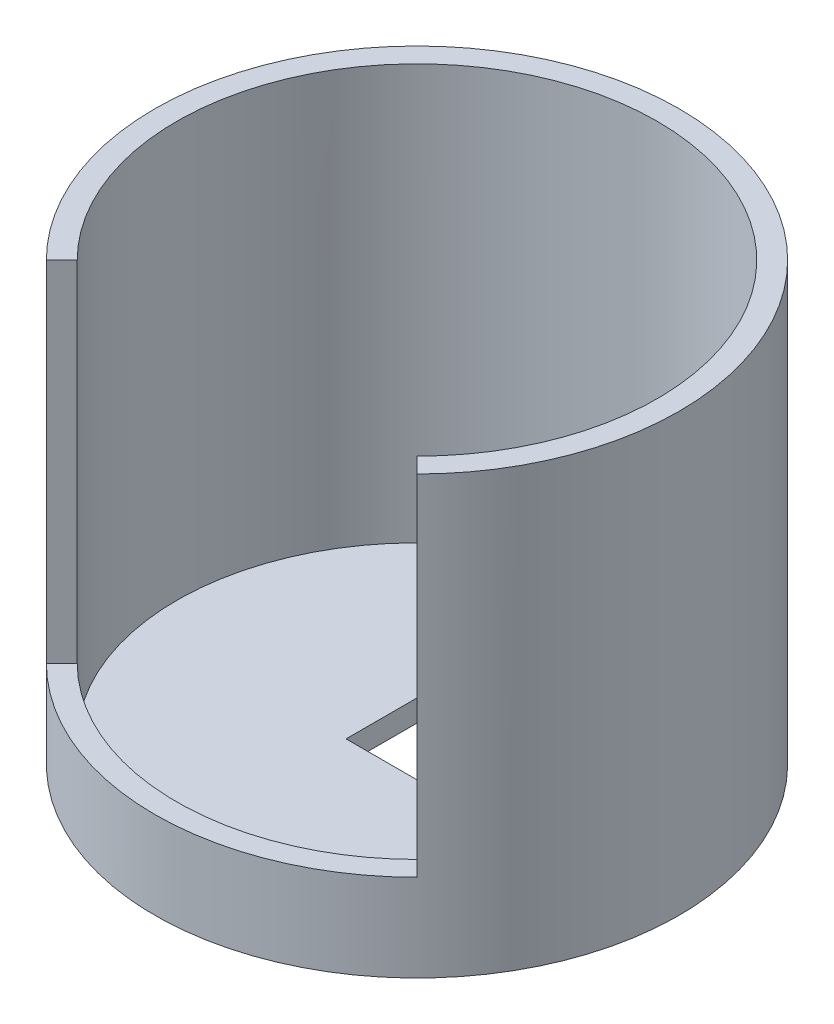
ISO-10303-21;
HEADER;
FILE_DESCRIPTION(('STEP AP214'),'2;1');
FILE_NAME('part.step','',(''),(''),'','','');
FILE_SCHEMA(('AUTOMOTIVE_DESIGN { 1 0 10303 214 1 1 1 1 }'));
ENDSEC;
DATA;
#1=APPLICATION_CONTEXT('core data for automotive mechanical design processes');
#2=APPLICATION_PROTOCOL_DEFINITION('international standard','automotive_design',2000,#1);
#3=PRODUCT_CONTEXT('',#1,'mechanical');
#4=PRODUCT('Part','Part','',(#3));
#5=PRODUCT_RELATED_PRODUCT_CATEGORY('part','',(#4));
#6=PRODUCT_DEFINITION_FORMATION('','',#4);
#7=PRODUCT_DEFINITION_CONTEXT('part definition',#1,'design');
#8=PRODUCT_DEFINITION('design','',#6,#7);
#9=PRODUCT_DEFINITION_SHAPE('','',#8);
#10=(LENGTH_UNIT() NAMED_UNIT(*) SI_UNIT(.MILLI.,.METRE.));
#11=(NAMED_UNIT(*) PLANE_ANGLE_UNIT() SI_UNIT($,.RADIAN.));
#12=(NAMED_UNIT(*) SI_UNIT($,.STERADIAN.) SOLID_ANGLE_UNIT());
#13=UNCERTAINTY_MEASURE_WITH_UNIT(LENGTH_MEASURE(1.E-05),#10,'distance_accuracy_value','');
#14=(GEOMETRIC_REPRESENTATION_CONTEXT(3) GLOBAL_UNCERTAINTY_ASSIGNED_CONTEXT((#13)) GLOBAL_UNIT_ASSIGNED_CONTEXT((#10,
#11,#12)) REPRESENTATION_CONTEXT('',''));
#15=CARTESIAN_POINT('',(0.,0.,0.));
#16=DIRECTION('',(0.,0.,1.));
#17=DIRECTION('',(1.,0.,0.));
#18=AXIS2_PLACEMENT_3D('',#15,#16,#17);
#19=CARTESIAN_POINT('',(0.,12.7,0.));
#20=DIRECTION('',(0.,-1.,0.));
#21=DIRECTION('',(0.,0.,-1.));
#22=AXIS2_PLACEMENT_3D('',#19,#20,#21);
#23=CYLINDRICAL_SURFACE('',#22,139.7);
#24=CARTESIAN_POINT('',(0.,12.7,0.));
#25=DIRECTION('',(0.,1.,0.));
#26=DIRECTION('',(0.,0.,1.));
#27=AXIS2_PLACEMENT_3D('',#24,#25,#26);
#28=CIRCLE('',#27,139.7);
#29=CARTESIAN_POINT('',(0.,12.7,139.7));
#30=VERTEX_POINT('',#29);
#31=EDGE_CURVE('E13',#30,#30,#28,.T.);
#32=ORIENTED_EDGE('',*,*,#31,.F.);
#33=EDGE_LOOP('',(#32));
#34=FACE_BOUND('',#33,.T.);
#35=CARTESIAN_POINT('',(0.,0.,0.));
#36=DIRECTION('',(0.,1.,0.));
#37=DIRECTION('',(0.,0.,1.));
#38=AXIS2_PLACEMENT_3D('',#35,#36,#37);
#39=CIRCLE('',#38,139.7);
#40=CARTESIAN_POINT('',(0.,0.,139.7));
#41=VERTEX_POINT('',#40);
#42=EDGE_CURVE('E75',#41,#41,#39,.T.);
#43=ORIENTED_EDGE('',*,*,#42,.T.);
#44=EDGE_LOOP('',(#43));
#45=FACE_BOUND('',#44,.T.);
#46=ADVANCED_FACE('F72',(#34,#45),#23,.T.);
#47=CARTESIAN_POINT('',(0.,12.7,0.));
#48=DIRECTION('',(0.,1.,0.));
#49=DIRECTION('',(0.,0.,1.));
#50=AXIS2_PLACEMENT_3D('',#47,#48,#49);
#51=PLANE('',#50);
#52=DIRECTION('',(1.,0.,0.));
#53=VECTOR('',#52,1.);
#54=CARTESIAN_POINT('',(-20.6375,12.7,-20.6375));
#55=LINE('',#54,#53);
#56=CARTESIAN_POINT('',(-20.6375,12.7,-20.6375));
#57=VERTEX_POINT('',#56);
#58=CARTESIAN_POINT('',(20.6375,12.7,-20.6375));
#59=VERTEX_POINT('',#58);
#60=EDGE_CURVE('E119',#57,#59,#55,.T.);
#61=ORIENTED_EDGE('',*,*,#60,.T.);
#62=DIRECTION('',(0.,0.,-1.));
#63=VECTOR('',#62,1.);
#64=CARTESIAN_POINT('',(20.6375,12.7,20.6375));
#65=LINE('',#64,#63);
#66=CARTESIAN_POINT('',(20.6375,12.7,20.6375));
#67=VERTEX_POINT('',#66);
#68=EDGE_CURVE('E111',#67,#59,#65,.T.);
#69=ORIENTED_EDGE('',*,*,#68,.F.);
#70=DIRECTION('',(1.,0.,0.));
#71=VECTOR('',#70,1.);
#72=CARTESIAN_POINT('',(-20.6375,12.7,20.6375));
#73=LINE('',#72,#71);
#74=CARTESIAN_POINT('',(-20.6375,12.7,20.6375));
#75=VERTEX_POINT('',#74);
#76=EDGE_CURVE('E118',#75,#67,#73,.T.);
#77=ORIENTED_EDGE('',*,*,#76,.F.);
#78=DIRECTION('',(0.,0.,-1.));
#79=VECTOR('',#78,1.);
#80=CARTESIAN_POINT('',(-20.6375,12.7,20.6375));
#81=LINE('',#80,#79);
#82=EDGE_CURVE('E124',#75,#57,#81,.T.);
#83=ORIENTED_EDGE('',*,*,#82,.T.);
#84=EDGE_LOOP('',(#61,#69,#77,#83));
#85=FACE_BOUND('',#84,.T.);
#86=ORIENTED_EDGE('',*,*,#31,.T.);
#87=EDGE_LOOP('',(#86));
#88=FACE_BOUND('',#87,.T.);
#89=ADVANCED_FACE('F126',(#85,#88),#51,.T.);
#90=CARTESIAN_POINT('',(0.,0.,0.));
#91=DIRECTION('',(0.,1.,0.));
#92=DIRECTION('',(0.,0.,1.));
#93=AXIS2_PLACEMENT_3D('',#90,#91,#92);
#94=PLANE('',#93);
#95=DIRECTION('',(0.,0.,-1.));
#96=VECTOR('',#95,1.);
#97=CARTESIAN_POINT('',(20.6375,0.,20.6375));
#98=LINE('',#97,#96);
#99=CARTESIAN_POINT('',(20.6375,0.,20.6375));
#100=VERTEX_POINT('',#99);
#101=CARTESIAN_POINT('',(20.6375,0.,-20.6375));
#102=VERTEX_POINT('',#101);
#103=EDGE_CURVE('E138',#100,#102,#98,.T.);
#104=ORIENTED_EDGE('',*,*,#103,.T.);
#105=DIRECTION('',(1.,0.,0.));
#106=VECTOR('',#105,1.);
#107=CARTESIAN_POINT('',(-20.6375,0.,-20.6375));
#108=LINE('',#107,#106);
#109=CARTESIAN_POINT('',(-20.6375,0.,-20.6375));
#110=VERTEX_POINT('',#109);
#111=EDGE_CURVE('E94',#110,#102,#108,.T.);
#112=ORIENTED_EDGE('',*,*,#111,.F.);
#113=DIRECTION('',(0.,0.,-1.));
#114=VECTOR('',#113,1.);
#115=CARTESIAN_POINT('',(-20.6375,0.,20.6375));
#116=LINE('',#115,#114);
#117=CARTESIAN_POINT('',(-20.6375,0.,20.6375));
#118=VERTEX_POINT('',#117);
#119=EDGE_CURVE('E129',#118,#110,#116,.T.);
#120=ORIENTED_EDGE('',*,*,#119,.F.);
#121=DIRECTION('',(1.,0.,0.));
#122=VECTOR('',#121,1.);
#123=CARTESIAN_POINT('',(-20.6375,0.,20.6375));
#124=LINE('',#123,#122);
#125=EDGE_CURVE('E132',#118,#100,#124,.T.);
#126=ORIENTED_EDGE('',*,*,#125,.T.);
#127=EDGE_LOOP('',(#104,#112,#120,#126));
#128=FACE_BOUND('',#127,.T.);
#129=ORIENTED_EDGE('',*,*,#42,.F.);
#130=EDGE_LOOP('',(#129));
#131=FACE_BOUND('',#130,.T.);
#132=ADVANCED_FACE('F151',(#128,#131),#94,.F.);
#133=CARTESIAN_POINT('',(-20.6375,12.7,-20.6375));
#134=DIRECTION('',(0.,0.,-1.));
#135=DIRECTION('',(-1.,0.,0.));
#136=AXIS2_PLACEMENT_3D('',#133,#134,#135);
#137=PLANE('',#136);
#138=ORIENTED_EDGE('',*,*,#111,.T.);
#139=DIRECTION('',(0.,-1.,0.));
#140=VECTOR('',#139,1.);
#141=CARTESIAN_POINT('',(20.6375,12.7,-20.6375));
#142=LINE('',#141,#140);
#143=EDGE_CURVE('E113',#59,#102,#142,.T.);
#144=ORIENTED_EDGE('',*,*,#143,.F.);
#145=ORIENTED_EDGE('',*,*,#60,.F.);
#146=DIRECTION('',(0.,-1.,0.));
#147=VECTOR('',#146,1.);
#148=CARTESIAN_POINT('',(-20.6375,12.7,-20.6375));
#149=LINE('',#148,#147);
#150=EDGE_CURVE('E142',#57,#110,#149,.T.);
#151=ORIENTED_EDGE('',*,*,#150,.T.);
#152=EDGE_LOOP('',(#138,#144,#145,#151));
#153=FACE_BOUND('',#152,.T.);
#154=ADVANCED_FACE('F122',(#153),#137,.F.);
#155=CARTESIAN_POINT('',(-20.6375,12.7,20.6375));
#156=DIRECTION('',(-1.,0.,0.));
#157=DIRECTION('',(0.,0.,1.));
#158=AXIS2_PLACEMENT_3D('',#155,#156,#157);
#159=PLANE('',#158);
#160=ORIENTED_EDGE('',*,*,#119,.T.);
#161=ORIENTED_EDGE('',*,*,#150,.F.);
#162=ORIENTED_EDGE('',*,*,#82,.F.);
#163=DIRECTION('',(0.,-1.,0.));
#164=VECTOR('',#163,1.);
#165=CARTESIAN_POINT('',(-20.6375,12.7,20.6375));
#166=LINE('',#165,#164);
#167=EDGE_CURVE('E144',#75,#118,#166,.T.);
#168=ORIENTED_EDGE('',*,*,#167,.T.);
#169=EDGE_LOOP('',(#160,#161,#162,#168));
#170=FACE_BOUND('',#169,.T.);
#171=ADVANCED_FACE('F154',(#170),#159,.F.);
#172=CARTESIAN_POINT('',(-20.6375,12.7,20.6375));
#173=DIRECTION('',(0.,0.,-1.));
#174=DIRECTION('',(-1.,0.,0.));
#175=AXIS2_PLACEMENT_3D('',#172,#173,#174);
#176=PLANE('',#175);
#177=ORIENTED_EDGE('',*,*,#125,.F.);
#178=ORIENTED_EDGE('',*,*,#167,.F.);
#179=ORIENTED_EDGE('',*,*,#76,.T.);
#180=DIRECTION('',(0.,-1.,0.));
#181=VECTOR('',#180,1.);
#182=CARTESIAN_POINT('',(20.6375,12.7,20.6375));
#183=LINE('',#182,#181);
#184=EDGE_CURVE('E86',#67,#100,#183,.T.);
#185=ORIENTED_EDGE('',*,*,#184,.T.);
#186=EDGE_LOOP('',(#177,#178,#179,#185));
#187=FACE_BOUND('',#186,.T.);
#188=ADVANCED_FACE('F148',(#187),#176,.T.);
#189=CARTESIAN_POINT('',(20.6375,12.7,20.6375));
#190=DIRECTION('',(-1.,0.,0.));
#191=DIRECTION('',(0.,0.,1.));
#192=AXIS2_PLACEMENT_3D('',#189,#190,#191);
#193=PLANE('',#192);
#194=ORIENTED_EDGE('',*,*,#103,.F.);
#195=ORIENTED_EDGE('',*,*,#184,.F.);
#196=ORIENTED_EDGE('',*,*,#68,.T.);
#197=ORIENTED_EDGE('',*,*,#143,.T.);
#198=EDGE_LOOP('',(#194,#195,#196,#197));
#199=FACE_BOUND('',#198,.T.);
#200=ADVANCED_FACE('F112',(#199),#193,.T.);
#201=CLOSED_SHELL('',(#46,#89,#132,#154,#171,#188,#200));
#202=MANIFOLD_SOLID_BREP('B2',#201);
#203=CARTESIAN_POINT('',(0.,0.,0.));
#204=DIRECTION('',(0.,-1.,0.));
#205=DIRECTION('',(0.,0.,-1.));
#206=AXIS2_PLACEMENT_3D('',#203,#204,#205);
#207=CYLINDRICAL_SURFACE('',#206,139.794899658551);
#208=CARTESIAN_POINT('',(0.,50.8,0.));
#209=DIRECTION('',(0.,-1.,0.));
#210=DIRECTION('',(0.,0.,-1.));
#211=AXIS2_PLACEMENT_3D('',#208,#209,#210);
#212=CIRCLE('',#211,139.794899658551);
#213=CARTESIAN_POINT('',(98.8499215238542,50.8,98.8499215238541));
#214=VERTEX_POINT('',#213);
#215=CARTESIAN_POINT('',(-98.8499215238528,50.8,98.8499215238555));
#216=VERTEX_POINT('',#215);
#217=EDGE_CURVE('E241',#214,#216,#212,.T.);
#218=ORIENTED_EDGE('',*,*,#217,.F.);
#219=DIRECTION('',(0.,1.,0.));
#220=VECTOR('',#219,1.);
#221=CARTESIAN_POINT('',(98.8499215238542,0.,98.8499215238542));
#222=LINE('',#221,#220);
#223=CARTESIAN_POINT('',(98.8499215238541,254.,98.8499215238542));
#224=VERTEX_POINT('',#223);
#225=EDGE_CURVE('E260',#214,#224,#222,.T.);
#226=ORIENTED_EDGE('',*,*,#225,.T.);
#227=CARTESIAN_POINT('',(0.,254.,0.));
#228=DIRECTION('',(0.,-1.,0.));
#229=DIRECTION('',(0.,0.,-1.));
#230=AXIS2_PLACEMENT_3D('',#227,#228,#229);
#231=CIRCLE('',#230,139.794899658551);
#232=CARTESIAN_POINT('',(-98.8499215238528,254.,98.8499215238555));
#233=VERTEX_POINT('',#232);
#234=EDGE_CURVE('E263',#233,#224,#231,.T.);
#235=ORIENTED_EDGE('',*,*,#234,.F.);
#236=DIRECTION('',(0.,1.,0.));
#237=VECTOR('',#236,1.);
#238=CARTESIAN_POINT('',(-98.8499215238528,0.,98.8499215238556));
#239=LINE('',#238,#237);
#240=EDGE_CURVE('E287',#216,#233,#239,.T.);
#241=ORIENTED_EDGE('',*,*,#240,.F.);
#242=EDGE_LOOP('',(#218,#226,#235,#241));
#243=FACE_BOUND('',#242,.T.);
#244=CARTESIAN_POINT('',(0.,0.,0.));
#245=DIRECTION('',(0.,-1.,0.));
#246=DIRECTION('',(0.,0.,-1.));
#247=AXIS2_PLACEMENT_3D('',#244,#245,#246);
#248=CIRCLE('',#247,139.794899658551);
#249=CARTESIAN_POINT('',(0.,0.,-139.794899658551));
#250=VERTEX_POINT('',#249);
#251=EDGE_CURVE('E70',#250,#250,#248,.T.);
#252=ORIENTED_EDGE('',*,*,#251,.T.);
#253=EDGE_LOOP('',(#252));
#254=FACE_BOUND('',#253,.T.);
#255=ADVANCED_FACE('F217',(#243,#254),#207,.F.);
#256=CARTESIAN_POINT('',(107.830177644923,0.,107.830177644923));
#257=DIRECTION('',(0.,1.,0.));
#258=DIRECTION('',(0.,0.,1.));
#259=AXIS2_PLACEMENT_3D('',#256,#257,#258);
#260=PLANE('',#259);
#261=ORIENTED_EDGE('',*,*,#251,.F.);
#262=EDGE_LOOP('',(#261));
#263=FACE_BOUND('',#262,.T.);
#264=CARTESIAN_POINT('',(0.,0.,0.));
#265=DIRECTION('',(0.,-1.,0.));
#266=DIRECTION('',(0.,0.,-1.));
#267=AXIS2_PLACEMENT_3D('',#264,#265,#266);
#268=CIRCLE('',#267,152.494899658551);
#269=CARTESIAN_POINT('',(0.,0.,-152.494899658551));
#270=VERTEX_POINT('',#269);
#271=EDGE_CURVE('E226',#270,#270,#268,.T.);
#272=ORIENTED_EDGE('',*,*,#271,.T.);
#273=EDGE_LOOP('',(#272));
#274=FACE_BOUND('',#273,.T.);
#275=ADVANCED_FACE('F219',(#263,#274),#260,.F.);
#276=CARTESIAN_POINT('',(0.,0.,0.));
#277=DIRECTION('',(0.,-1.,0.));
#278=DIRECTION('',(0.,0.,-1.));
#279=AXIS2_PLACEMENT_3D('',#276,#277,#278);
#280=CYLINDRICAL_SURFACE('',#279,152.494899658551);
#281=DIRECTION('',(0.,1.,0.));
#282=VECTOR('',#281,1.);
#283=CARTESIAN_POINT('',(107.830177644923,0.,107.830177644923));
#284=LINE('',#283,#282);
#285=CARTESIAN_POINT('',(107.830177644923,50.8,107.830177644923));
#286=VERTEX_POINT('',#285);
#287=CARTESIAN_POINT('',(107.830177644923,254.,107.830177644923));
#288=VERTEX_POINT('',#287);
#289=EDGE_CURVE('E282',#286,#288,#284,.T.);
#290=ORIENTED_EDGE('',*,*,#289,.F.);
#291=CARTESIAN_POINT('',(0.,50.8,0.));
#292=DIRECTION('',(0.,-1.,0.));
#293=DIRECTION('',(0.,0.,-1.));
#294=AXIS2_PLACEMENT_3D('',#291,#292,#293);
#295=CIRCLE('',#294,152.494899658551);
#296=CARTESIAN_POINT('',(-107.830177644922,50.8,107.830177644925));
#297=VERTEX_POINT('',#296);
#298=EDGE_CURVE('E233',#286,#297,#295,.T.);
#299=ORIENTED_EDGE('',*,*,#298,.T.);
#300=DIRECTION('',(0.,1.,0.));
#301=VECTOR('',#300,1.);
#302=CARTESIAN_POINT('',(-107.830177644922,0.,107.830177644925));
#303=LINE('',#302,#301);
#304=CARTESIAN_POINT('',(-107.830177644922,254.,107.830177644925));
#305=VERTEX_POINT('',#304);
#306=EDGE_CURVE('E294',#297,#305,#303,.T.);
#307=ORIENTED_EDGE('',*,*,#306,.T.);
#308=CARTESIAN_POINT('',(0.,254.,0.));
#309=DIRECTION('',(0.,-1.,0.));
#310=DIRECTION('',(0.,0.,-1.));
#311=AXIS2_PLACEMENT_3D('',#308,#309,#310);
#312=CIRCLE('',#311,152.494899658551);
#313=EDGE_CURVE('E278',#305,#288,#312,.T.);
#314=ORIENTED_EDGE('',*,*,#313,.T.);
#315=EDGE_LOOP('',(#290,#299,#307,#314));
#316=FACE_BOUND('',#315,.T.);
#317=ORIENTED_EDGE('',*,*,#271,.F.);
#318=EDGE_LOOP('',(#317));
#319=FACE_BOUND('',#318,.T.);
#320=ADVANCED_FACE('F312',(#316,#319),#280,.T.);
#321=CARTESIAN_POINT('',(107.830177644923,50.8,107.830177644923));
#322=DIRECTION('',(0.,1.,0.));
#323=DIRECTION('',(0.,0.,1.));
#324=AXIS2_PLACEMENT_3D('',#321,#322,#323);
#325=PLANE('',#324);
#326=DIRECTION('',(-0.707106781186548,0.,-0.707106781186548));
#327=VECTOR('',#326,1.);
#328=CARTESIAN_POINT('',(107.830177644923,50.8,107.830177644923));
#329=LINE('',#328,#327);
#330=EDGE_CURVE('E301',#286,#214,#329,.T.);
#331=ORIENTED_EDGE('',*,*,#330,.T.);
#332=ORIENTED_EDGE('',*,*,#217,.T.);
#333=DIRECTION('',(0.707106781186548,0.,-0.707106781186548));
#334=VECTOR('',#333,1.);
#335=CARTESIAN_POINT('',(-107.830177644923,50.8,107.830177644923));
#336=LINE('',#335,#334);
#337=EDGE_CURVE('E277',#297,#216,#336,.T.);
#338=ORIENTED_EDGE('',*,*,#337,.F.);
#339=ORIENTED_EDGE('',*,*,#298,.F.);
#340=EDGE_LOOP('',(#331,#332,#338,#339));
#341=FACE_BOUND('',#340,.T.);
#342=ADVANCED_FACE('F314',(#341),#325,.T.);
#343=CARTESIAN_POINT('',(-107.830177644922,254.,107.830177644925));
#344=DIRECTION('',(0.,1.,0.));
#345=DIRECTION('',(0.,0.,1.));
#346=AXIS2_PLACEMENT_3D('',#343,#344,#345);
#347=PLANE('',#346);
#348=ORIENTED_EDGE('',*,*,#313,.F.);
#349=DIRECTION('',(0.707106781186538,0.,-0.707106781186557));
#350=VECTOR('',#349,1.);
#351=CARTESIAN_POINT('',(-107.830177644922,254.,107.830177644925));
#352=LINE('',#351,#350);
#353=EDGE_CURVE('E275',#305,#233,#352,.T.);
#354=ORIENTED_EDGE('',*,*,#353,.T.);
#355=ORIENTED_EDGE('',*,*,#234,.T.);
#356=DIRECTION('',(-0.707106781186548,0.,-0.707106781186548));
#357=VECTOR('',#356,1.);
#358=CARTESIAN_POINT('',(107.830177644923,254.,107.830177644923));
#359=LINE('',#358,#357);
#360=EDGE_CURVE('E268',#288,#224,#359,.T.);
#361=ORIENTED_EDGE('',*,*,#360,.F.);
#362=EDGE_LOOP('',(#348,#354,#355,#361));
#363=FACE_BOUND('',#362,.T.);
#364=ADVANCED_FACE('F273',(#363),#347,.T.);
#365=CARTESIAN_POINT('',(0.,0.,0.));
#366=DIRECTION('',(-0.707106781186557,0.,-0.707106781186538));
#367=DIRECTION('',(-0.707106781186538,0.,0.707106781186557));
#368=AXIS2_PLACEMENT_3D('',#365,#366,#367);
#369=PLANE('',#368);
#370=ORIENTED_EDGE('',*,*,#337,.T.);
#371=ORIENTED_EDGE('',*,*,#240,.T.);
#372=ORIENTED_EDGE('',*,*,#353,.F.);
#373=ORIENTED_EDGE('',*,*,#306,.F.);
#374=EDGE_LOOP('',(#370,#371,#372,#373));
#375=FACE_BOUND('',#374,.T.);
#376=ADVANCED_FACE('F329',(#375),#369,.F.);
#377=CARTESIAN_POINT('',(0.,0.,0.));
#378=DIRECTION('',(-0.707106781186548,0.,0.707106781186548));
#379=DIRECTION('',(0.707106781186548,0.,0.707106781186548));
#380=AXIS2_PLACEMENT_3D('',#377,#378,#379);
#381=PLANE('',#380);
#382=ORIENTED_EDGE('',*,*,#225,.F.);
#383=ORIENTED_EDGE('',*,*,#330,.F.);
#384=ORIENTED_EDGE('',*,*,#289,.T.);
#385=ORIENTED_EDGE('',*,*,#360,.T.);
#386=EDGE_LOOP('',(#382,#383,#384,#385));
#387=FACE_BOUND('',#386,.T.);
#388=ADVANCED_FACE('F280',(#387),#381,.T.);
#389=CLOSED_SHELL('',(#255,#275,#320,#342,#364,#376,#388));
#390=MANIFOLD_SOLID_BREP('B7',#389);
#391=ADVANCED_BREP_SHAPE_REPRESENTATION('',(#18,#202,#390),#14);
#392=SHAPE_DEFINITION_REPRESENTATION(#9,#391);
ENDSEC;
END-ISO-10303-21;
